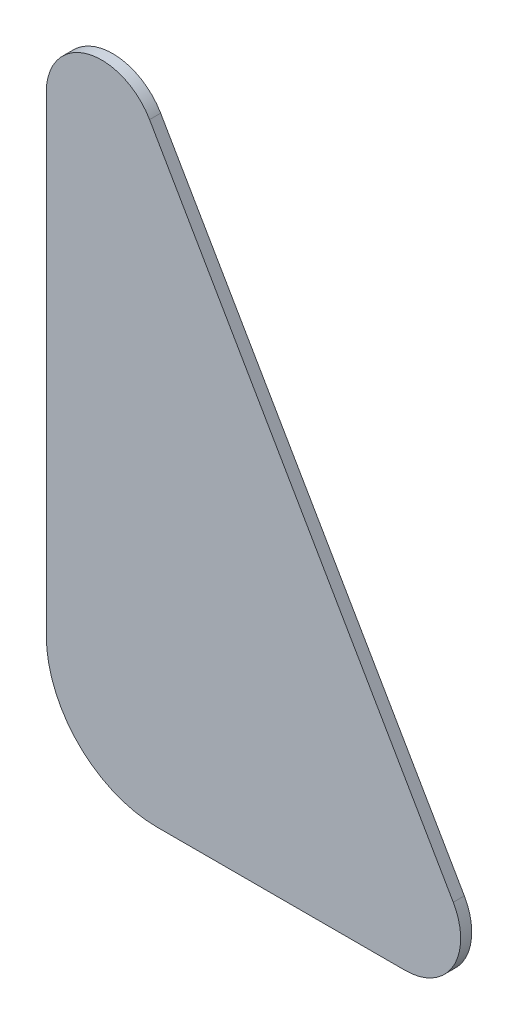
ISO-10303-21;
HEADER;
FILE_DESCRIPTION(('STEP AP214'),'2;1');
FILE_NAME('part.step','',(''),(''),'','','');
FILE_SCHEMA(('AUTOMOTIVE_DESIGN { 1 0 10303 214 1 1 1 1 }'));
ENDSEC;
DATA;
#1=APPLICATION_CONTEXT('core data for automotive mechanical design processes');
#2=APPLICATION_PROTOCOL_DEFINITION('international standard','automotive_design',2000,#1);
#3=PRODUCT_CONTEXT('',#1,'mechanical');
#4=PRODUCT('Part','Part','',(#3));
#5=PRODUCT_RELATED_PRODUCT_CATEGORY('part','',(#4));
#6=PRODUCT_DEFINITION_FORMATION('','',#4);
#7=PRODUCT_DEFINITION_CONTEXT('part definition',#1,'design');
#8=PRODUCT_DEFINITION('design','',#6,#7);
#9=PRODUCT_DEFINITION_SHAPE('','',#8);
#10=(LENGTH_UNIT() NAMED_UNIT(*) SI_UNIT(.MILLI.,.METRE.));
#11=(NAMED_UNIT(*) PLANE_ANGLE_UNIT() SI_UNIT($,.RADIAN.));
#12=(NAMED_UNIT(*) SI_UNIT($,.STERADIAN.) SOLID_ANGLE_UNIT());
#13=UNCERTAINTY_MEASURE_WITH_UNIT(LENGTH_MEASURE(1.E-05),#10,'distance_accuracy_value','');
#14=(GEOMETRIC_REPRESENTATION_CONTEXT(3) GLOBAL_UNCERTAINTY_ASSIGNED_CONTEXT((#13)) GLOBAL_UNIT_ASSIGNED_CONTEXT((#10,
#11,#12)) REPRESENTATION_CONTEXT('',''));
#15=CARTESIAN_POINT('',(0.,0.,0.));
#16=DIRECTION('',(0.,0.,1.));
#17=DIRECTION('',(1.,0.,0.));
#18=AXIS2_PLACEMENT_3D('',#15,#16,#17);
#19=CARTESIAN_POINT('',(100.,100.,10.));
#20=DIRECTION('',(0.,0.,-1.));
#21=DIRECTION('',(-1.,0.,0.));
#22=AXIS2_PLACEMENT_3D('',#19,#20,#21);
#23=CYLINDRICAL_SURFACE('',#22,100.);
#24=CARTESIAN_POINT('',(100.,100.,0.));
#25=DIRECTION('',(0.,0.,1.));
#26=DIRECTION('',(1.,0.,0.));
#27=AXIS2_PLACEMENT_3D('',#24,#25,#26);
#28=CIRCLE('',#27,100.);
#29=CARTESIAN_POINT('',(0.,100.000000000001,0.));
#30=VERTEX_POINT('',#29);
#31=CARTESIAN_POINT('',(100.000000000001,0.,0.));
#32=VERTEX_POINT('',#31);
#33=EDGE_CURVE('E120',#30,#32,#28,.T.);
#34=ORIENTED_EDGE('',*,*,#33,.T.);
#35=DIRECTION('',(0.,0.,-1.));
#36=VECTOR('',#35,1.);
#37=CARTESIAN_POINT('',(100.000000000001,0.,10.));
#38=LINE('',#37,#36);
#39=CARTESIAN_POINT('',(100.000000000001,0.,10.));
#40=VERTEX_POINT('',#39);
#41=EDGE_CURVE('E11',#40,#32,#38,.T.);
#42=ORIENTED_EDGE('',*,*,#41,.F.);
#43=CARTESIAN_POINT('',(100.,100.,10.));
#44=DIRECTION('',(0.,0.,1.));
#45=DIRECTION('',(1.,0.,0.));
#46=AXIS2_PLACEMENT_3D('',#43,#44,#45);
#47=CIRCLE('',#46,100.);
#48=CARTESIAN_POINT('',(0.,100.000000000001,10.));
#49=VERTEX_POINT('',#48);
#50=EDGE_CURVE('E130',#49,#40,#47,.T.);
#51=ORIENTED_EDGE('',*,*,#50,.F.);
#52=DIRECTION('',(0.,0.,-1.));
#53=VECTOR('',#52,1.);
#54=CARTESIAN_POINT('',(0.,100.000000000001,10.));
#55=LINE('',#54,#53);
#56=EDGE_CURVE('E116',#49,#30,#55,.T.);
#57=ORIENTED_EDGE('',*,*,#56,.T.);
#58=EDGE_LOOP('',(#34,#42,#51,#57));
#59=FACE_BOUND('',#58,.T.);
#60=ADVANCED_FACE('F36',(#59),#23,.T.);
#61=CARTESIAN_POINT('',(324.241377865075,0.,10.));
#62=DIRECTION('',(0.,1.,0.));
#63=DIRECTION('',(0.,0.,1.));
#64=AXIS2_PLACEMENT_3D('',#61,#62,#63);
#65=PLANE('',#64);
#66=DIRECTION('',(1.,0.,0.));
#67=VECTOR('',#66,1.);
#68=CARTESIAN_POINT('',(324.241377865075,0.,0.));
#69=LINE('',#68,#67);
#70=CARTESIAN_POINT('',(324.241377865075,0.,0.));
#71=VERTEX_POINT('',#70);
#72=EDGE_CURVE('E123',#32,#71,#69,.T.);
#73=ORIENTED_EDGE('',*,*,#72,.T.);
#74=DIRECTION('',(0.,0.,-1.));
#75=VECTOR('',#74,1.);
#76=CARTESIAN_POINT('',(324.241377865075,0.,10.));
#77=LINE('',#76,#75);
#78=CARTESIAN_POINT('',(324.241377865075,0.,10.));
#79=VERTEX_POINT('',#78);
#80=EDGE_CURVE('E44',#79,#71,#77,.T.);
#81=ORIENTED_EDGE('',*,*,#80,.F.);
#82=DIRECTION('',(1.,0.,0.));
#83=VECTOR('',#82,1.);
#84=CARTESIAN_POINT('',(324.241377865075,0.,10.));
#85=LINE('',#84,#83);
#86=EDGE_CURVE('E89',#40,#79,#85,.T.);
#87=ORIENTED_EDGE('',*,*,#86,.F.);
#88=ORIENTED_EDGE('',*,*,#41,.T.);
#89=EDGE_LOOP('',(#73,#81,#87,#88));
#90=FACE_BOUND('',#89,.T.);
#91=ADVANCED_FACE('F154',(#90),#65,.F.);
#92=CARTESIAN_POINT('',(324.241377865075,50.,10.));
#93=DIRECTION('',(0.,0.,-1.));
#94=DIRECTION('',(-1.,0.,0.));
#95=AXIS2_PLACEMENT_3D('',#92,#93,#94);
#96=CYLINDRICAL_SURFACE('',#95,50.);
#97=CARTESIAN_POINT('',(324.241377865075,50.,0.));
#98=DIRECTION('',(0.,0.,1.));
#99=DIRECTION('',(-1.,0.,0.));
#100=AXIS2_PLACEMENT_3D('',#97,#98,#99);
#101=CIRCLE('',#100,50.);
#102=CARTESIAN_POINT('',(367.542648054297,75.0000000000002,0.));
#103=VERTEX_POINT('',#102);
#104=EDGE_CURVE('E125',#71,#103,#101,.T.);
#105=ORIENTED_EDGE('',*,*,#104,.T.);
#106=DIRECTION('',(0.,0.,-1.));
#107=VECTOR('',#106,1.);
#108=CARTESIAN_POINT('',(367.542648054297,75.0000000000002,10.));
#109=LINE('',#108,#107);
#110=CARTESIAN_POINT('',(367.542648054297,75.0000000000002,10.));
#111=VERTEX_POINT('',#110);
#112=EDGE_CURVE('E111',#111,#103,#109,.T.);
#113=ORIENTED_EDGE('',*,*,#112,.F.);
#114=CARTESIAN_POINT('',(324.241377865075,50.,10.));
#115=DIRECTION('',(0.,0.,1.));
#116=DIRECTION('',(-1.,0.,0.));
#117=AXIS2_PLACEMENT_3D('',#114,#115,#116);
#118=CIRCLE('',#117,50.);
#119=EDGE_CURVE('E102',#79,#111,#118,.T.);
#120=ORIENTED_EDGE('',*,*,#119,.F.);
#121=ORIENTED_EDGE('',*,*,#80,.T.);
#122=EDGE_LOOP('',(#105,#113,#120,#121));
#123=FACE_BOUND('',#122,.T.);
#124=ADVANCED_FACE('F136',(#123),#96,.T.);
#125=CARTESIAN_POINT('',(93.3012701892218,550.,10.));
#126=DIRECTION('',(-0.866025403784436,-0.500000000000004,0.));
#127=DIRECTION('',(0.500000000000004,-0.866025403784436,0.));
#128=AXIS2_PLACEMENT_3D('',#125,#126,#127);
#129=PLANE('',#128);
#130=DIRECTION('',(-0.500000000000004,0.866025403784436,0.));
#131=VECTOR('',#130,1.);
#132=CARTESIAN_POINT('',(93.3012701892218,550.,0.));
#133=LINE('',#132,#131);
#134=CARTESIAN_POINT('',(93.3012701892218,550.,0.));
#135=VERTEX_POINT('',#134);
#136=EDGE_CURVE('E110',#103,#135,#133,.T.);
#137=ORIENTED_EDGE('',*,*,#136,.T.);
#138=DIRECTION('',(0.,0.,-1.));
#139=VECTOR('',#138,1.);
#140=CARTESIAN_POINT('',(93.3012701892218,550.,10.));
#141=LINE('',#140,#139);
#142=CARTESIAN_POINT('',(93.3012701892218,550.,10.));
#143=VERTEX_POINT('',#142);
#144=EDGE_CURVE('E107',#143,#135,#141,.T.);
#145=ORIENTED_EDGE('',*,*,#144,.F.);
#146=DIRECTION('',(-0.500000000000004,0.866025403784436,0.));
#147=VECTOR('',#146,1.);
#148=CARTESIAN_POINT('',(93.3012701892218,550.,10.));
#149=LINE('',#148,#147);
#150=EDGE_CURVE('E96',#111,#143,#149,.T.);
#151=ORIENTED_EDGE('',*,*,#150,.F.);
#152=ORIENTED_EDGE('',*,*,#112,.T.);
#153=EDGE_LOOP('',(#137,#145,#151,#152));
#154=FACE_BOUND('',#153,.T.);
#155=ADVANCED_FACE('F108',(#154),#129,.F.);
#156=CARTESIAN_POINT('',(50.,525.,10.));
#157=DIRECTION('',(0.,0.,-1.));
#158=DIRECTION('',(-1.,0.,0.));
#159=AXIS2_PLACEMENT_3D('',#156,#157,#158);
#160=CYLINDRICAL_SURFACE('',#159,50.);
#161=CARTESIAN_POINT('',(50.,525.,0.));
#162=DIRECTION('',(0.,0.,1.));
#163=DIRECTION('',(-1.,0.,0.));
#164=AXIS2_PLACEMENT_3D('',#161,#162,#163);
#165=CIRCLE('',#164,50.);
#166=CARTESIAN_POINT('',(0.,525.,0.));
#167=VERTEX_POINT('',#166);
#168=EDGE_CURVE('E75',#135,#167,#165,.T.);
#169=ORIENTED_EDGE('',*,*,#168,.T.);
#170=DIRECTION('',(0.,0.,-1.));
#171=VECTOR('',#170,1.);
#172=CARTESIAN_POINT('',(0.,525.,10.));
#173=LINE('',#172,#171);
#174=CARTESIAN_POINT('',(0.,525.,10.));
#175=VERTEX_POINT('',#174);
#176=EDGE_CURVE('E112',#175,#167,#173,.T.);
#177=ORIENTED_EDGE('',*,*,#176,.F.);
#178=CARTESIAN_POINT('',(50.,525.,10.));
#179=DIRECTION('',(0.,0.,1.));
#180=DIRECTION('',(-1.,0.,0.));
#181=AXIS2_PLACEMENT_3D('',#178,#179,#180);
#182=CIRCLE('',#181,50.);
#183=EDGE_CURVE('E100',#143,#175,#182,.T.);
#184=ORIENTED_EDGE('',*,*,#183,.F.);
#185=ORIENTED_EDGE('',*,*,#144,.T.);
#186=EDGE_LOOP('',(#169,#177,#184,#185));
#187=FACE_BOUND('',#186,.T.);
#188=ADVANCED_FACE('F114',(#187),#160,.T.);
#189=CARTESIAN_POINT('',(0.,100.000000000001,10.));
#190=DIRECTION('',(1.,0.,0.));
#191=DIRECTION('',(0.,0.,-1.));
#192=AXIS2_PLACEMENT_3D('',#189,#190,#191);
#193=PLANE('',#192);
#194=DIRECTION('',(0.,-1.,0.));
#195=VECTOR('',#194,1.);
#196=CARTESIAN_POINT('',(0.,100.000000000001,0.));
#197=LINE('',#196,#195);
#198=EDGE_CURVE('E81',#167,#30,#197,.T.);
#199=ORIENTED_EDGE('',*,*,#198,.T.);
#200=ORIENTED_EDGE('',*,*,#56,.F.);
#201=DIRECTION('',(0.,-1.,0.));
#202=VECTOR('',#201,1.);
#203=CARTESIAN_POINT('',(0.,100.000000000001,10.));
#204=LINE('',#203,#202);
#205=EDGE_CURVE('E52',#175,#49,#204,.T.);
#206=ORIENTED_EDGE('',*,*,#205,.F.);
#207=ORIENTED_EDGE('',*,*,#176,.T.);
#208=EDGE_LOOP('',(#199,#200,#206,#207));
#209=FACE_BOUND('',#208,.T.);
#210=ADVANCED_FACE('F143',(#209),#193,.F.);
#211=CARTESIAN_POINT('',(100.,100.,10.));
#212=DIRECTION('',(0.,0.,1.));
#213=DIRECTION('',(1.,0.,0.));
#214=AXIS2_PLACEMENT_3D('',#211,#212,#213);
#215=PLANE('',#214);
#216=ORIENTED_EDGE('',*,*,#50,.T.);
#217=ORIENTED_EDGE('',*,*,#86,.T.);
#218=ORIENTED_EDGE('',*,*,#119,.T.);
#219=ORIENTED_EDGE('',*,*,#150,.T.);
#220=ORIENTED_EDGE('',*,*,#183,.T.);
#221=ORIENTED_EDGE('',*,*,#205,.T.);
#222=EDGE_LOOP('',(#216,#217,#218,#219,#220,#221));
#223=FACE_BOUND('',#222,.T.);
#224=ADVANCED_FACE('F98',(#223),#215,.T.);
#225=CARTESIAN_POINT('',(100.,100.,0.));
#226=DIRECTION('',(0.,0.,1.));
#227=DIRECTION('',(1.,0.,0.));
#228=AXIS2_PLACEMENT_3D('',#225,#226,#227);
#229=PLANE('',#228);
#230=ORIENTED_EDGE('',*,*,#33,.F.);
#231=ORIENTED_EDGE('',*,*,#198,.F.);
#232=ORIENTED_EDGE('',*,*,#168,.F.);
#233=ORIENTED_EDGE('',*,*,#136,.F.);
#234=ORIENTED_EDGE('',*,*,#104,.F.);
#235=ORIENTED_EDGE('',*,*,#72,.F.);
#236=EDGE_LOOP('',(#230,#231,#232,#233,#234,#235));
#237=FACE_BOUND('',#236,.T.);
#238=ADVANCED_FACE('F139',(#237),#229,.F.);
#239=CLOSED_SHELL('',(#60,#91,#124,#155,#188,#210,#224,#238));
#240=MANIFOLD_SOLID_BREP('B2',#239);
#241=ADVANCED_BREP_SHAPE_REPRESENTATION('',(#18,#240),#14);
#242=SHAPE_DEFINITION_REPRESENTATION(#9,#241);
ENDSEC;
END-ISO-10303-21;
